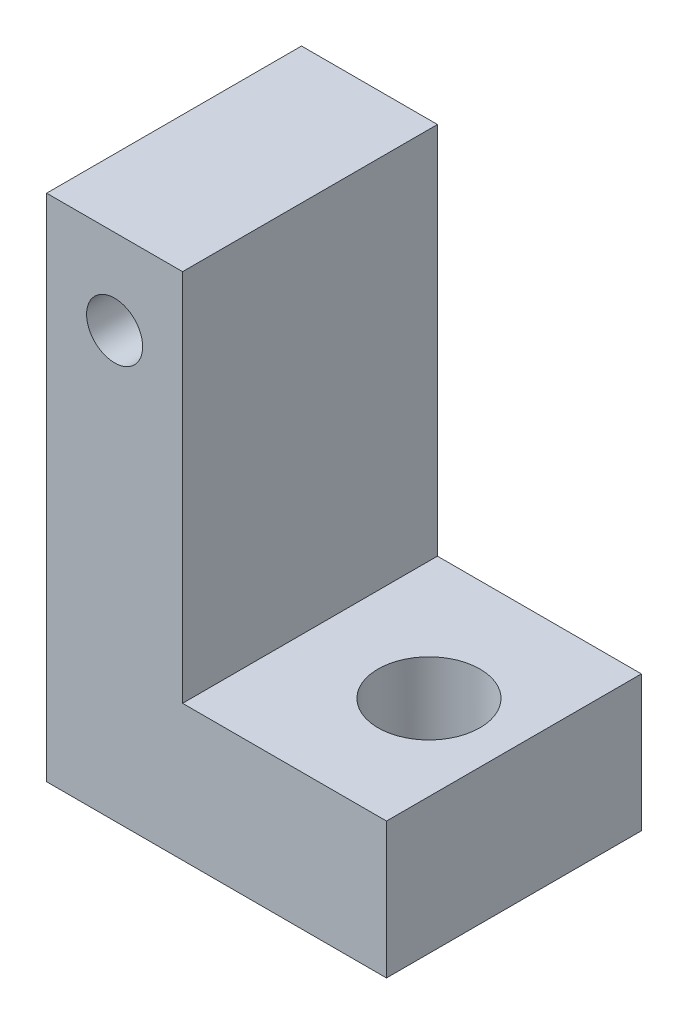
ISO-10303-21;
HEADER;
FILE_DESCRIPTION(('STEP AP214'),'2;1');
FILE_NAME('part.step','',(''),(''),'','','');
FILE_SCHEMA(('AUTOMOTIVE_DESIGN { 1 0 10303 214 1 1 1 1 }'));
ENDSEC;
DATA;
#1=APPLICATION_CONTEXT('core data for automotive mechanical design processes');
#2=APPLICATION_PROTOCOL_DEFINITION('international standard','automotive_design',2000,#1);
#3=PRODUCT_CONTEXT('',#1,'mechanical');
#4=PRODUCT('Part','Part','',(#3));
#5=PRODUCT_RELATED_PRODUCT_CATEGORY('part','',(#4));
#6=PRODUCT_DEFINITION_FORMATION('','',#4);
#7=PRODUCT_DEFINITION_CONTEXT('part definition',#1,'design');
#8=PRODUCT_DEFINITION('design','',#6,#7);
#9=PRODUCT_DEFINITION_SHAPE('','',#8);
#10=(LENGTH_UNIT() NAMED_UNIT(*) SI_UNIT(.MILLI.,.METRE.));
#11=(NAMED_UNIT(*) PLANE_ANGLE_UNIT() SI_UNIT($,.RADIAN.));
#12=(NAMED_UNIT(*) SI_UNIT($,.STERADIAN.) SOLID_ANGLE_UNIT());
#13=UNCERTAINTY_MEASURE_WITH_UNIT(LENGTH_MEASURE(1.E-05),#10,'distance_accuracy_value','');
#14=(GEOMETRIC_REPRESENTATION_CONTEXT(3) GLOBAL_UNCERTAINTY_ASSIGNED_CONTEXT((#13)) GLOBAL_UNIT_ASSIGNED_CONTEXT((#10,
#11,#12)) REPRESENTATION_CONTEXT('',''));
#15=CARTESIAN_POINT('',(0.,0.,0.));
#16=DIRECTION('',(0.,0.,1.));
#17=DIRECTION('',(1.,0.,0.));
#18=AXIS2_PLACEMENT_3D('',#15,#16,#17);
#19=CARTESIAN_POINT('',(0.,8.,15.));
#20=DIRECTION('',(-1.,0.,0.));
#21=DIRECTION('',(0.,-1.,0.));
#22=AXIS2_PLACEMENT_3D('',#19,#20,#21);
#23=PLANE('',#22);
#24=DIRECTION('',(0.,1.,0.));
#25=VECTOR('',#24,1.);
#26=CARTESIAN_POINT('',(0.,8.,0.));
#27=LINE('',#26,#25);
#28=CARTESIAN_POINT('',(0.,0.,0.));
#29=VERTEX_POINT('',#28);
#30=CARTESIAN_POINT('',(0.,8.,0.));
#31=VERTEX_POINT('',#30);
#32=EDGE_CURVE('E119',#29,#31,#27,.T.);
#33=ORIENTED_EDGE('',*,*,#32,.T.);
#34=DIRECTION('',(0.,0.,-1.));
#35=VECTOR('',#34,1.);
#36=CARTESIAN_POINT('',(0.,8.,15.));
#37=LINE('',#36,#35);
#38=CARTESIAN_POINT('',(0.,8.,15.));
#39=VERTEX_POINT('',#38);
#40=EDGE_CURVE('E11',#39,#31,#37,.T.);
#41=ORIENTED_EDGE('',*,*,#40,.F.);
#42=DIRECTION('',(0.,1.,0.));
#43=VECTOR('',#42,1.);
#44=CARTESIAN_POINT('',(0.,8.,15.));
#45=LINE('',#44,#43);
#46=CARTESIAN_POINT('',(0.,0.,15.));
#47=VERTEX_POINT('',#46);
#48=EDGE_CURVE('E130',#47,#39,#45,.T.);
#49=ORIENTED_EDGE('',*,*,#48,.F.);
#50=DIRECTION('',(0.,0.,-1.));
#51=VECTOR('',#50,1.);
#52=CARTESIAN_POINT('',(0.,0.,15.));
#53=LINE('',#52,#51);
#54=EDGE_CURVE('E115',#47,#29,#53,.T.);
#55=ORIENTED_EDGE('',*,*,#54,.T.);
#56=EDGE_LOOP('',(#33,#41,#49,#55));
#57=FACE_BOUND('',#56,.T.);
#58=ADVANCED_FACE('F35',(#57),#23,.F.);
#59=CARTESIAN_POINT('',(-12.,8.,15.));
#60=DIRECTION('',(0.,-1.,0.));
#61=DIRECTION('',(0.,0.,-1.));
#62=AXIS2_PLACEMENT_3D('',#59,#60,#61);
#63=PLANE('',#62);
#64=CARTESIAN_POINT('',(-5.,8.,7.5));
#65=DIRECTION('',(0.,-1.,0.));
#66=DIRECTION('',(0.,0.,-1.));
#67=AXIS2_PLACEMENT_3D('',#64,#65,#66);
#68=CIRCLE('',#67,3.);
#69=CARTESIAN_POINT('',(-5.,8.,4.5));
#70=VERTEX_POINT('',#69);
#71=EDGE_CURVE('E123',#70,#70,#68,.T.);
#72=ORIENTED_EDGE('',*,*,#71,.T.);
#73=EDGE_LOOP('',(#72));
#74=FACE_BOUND('',#73,.T.);
#75=DIRECTION('',(-1.,0.,0.));
#76=VECTOR('',#75,1.);
#77=CARTESIAN_POINT('',(-12.,8.,0.));
#78=LINE('',#77,#76);
#79=CARTESIAN_POINT('',(-12.,8.,0.));
#80=VERTEX_POINT('',#79);
#81=EDGE_CURVE('E122',#31,#80,#78,.T.);
#82=ORIENTED_EDGE('',*,*,#81,.T.);
#83=DIRECTION('',(0.,0.,-1.));
#84=VECTOR('',#83,1.);
#85=CARTESIAN_POINT('',(-12.,8.,15.));
#86=LINE('',#85,#84);
#87=CARTESIAN_POINT('',(-12.,8.,15.));
#88=VERTEX_POINT('',#87);
#89=EDGE_CURVE('E43',#88,#80,#86,.T.);
#90=ORIENTED_EDGE('',*,*,#89,.F.);
#91=DIRECTION('',(-1.,0.,0.));
#92=VECTOR('',#91,1.);
#93=CARTESIAN_POINT('',(-12.,8.,15.));
#94=LINE('',#93,#92);
#95=EDGE_CURVE('E88',#39,#88,#94,.T.);
#96=ORIENTED_EDGE('',*,*,#95,.F.);
#97=ORIENTED_EDGE('',*,*,#40,.T.);
#98=EDGE_LOOP('',(#82,#90,#96,#97));
#99=FACE_BOUND('',#98,.T.);
#100=ADVANCED_FACE('F157',(#74,#99),#63,.F.);
#101=CARTESIAN_POINT('',(-12.,30.,15.));
#102=DIRECTION('',(-1.,0.,0.));
#103=DIRECTION('',(0.,-1.,0.));
#104=AXIS2_PLACEMENT_3D('',#101,#102,#103);
#105=PLANE('',#104);
#106=DIRECTION('',(0.,1.,0.));
#107=VECTOR('',#106,1.);
#108=CARTESIAN_POINT('',(-12.,30.,0.));
#109=LINE('',#108,#107);
#110=CARTESIAN_POINT('',(-12.,30.,0.));
#111=VERTEX_POINT('',#110);
#112=EDGE_CURVE('E125',#80,#111,#109,.T.);
#113=ORIENTED_EDGE('',*,*,#112,.T.);
#114=DIRECTION('',(0.,0.,-1.));
#115=VECTOR('',#114,1.);
#116=CARTESIAN_POINT('',(-12.,30.,15.));
#117=LINE('',#116,#115);
#118=CARTESIAN_POINT('',(-12.,30.,15.));
#119=VERTEX_POINT('',#118);
#120=EDGE_CURVE('E110',#119,#111,#117,.T.);
#121=ORIENTED_EDGE('',*,*,#120,.F.);
#122=DIRECTION('',(0.,1.,0.));
#123=VECTOR('',#122,1.);
#124=CARTESIAN_POINT('',(-12.,30.,15.));
#125=LINE('',#124,#123);
#126=EDGE_CURVE('E101',#88,#119,#125,.T.);
#127=ORIENTED_EDGE('',*,*,#126,.F.);
#128=ORIENTED_EDGE('',*,*,#89,.T.);
#129=EDGE_LOOP('',(#113,#121,#127,#128));
#130=FACE_BOUND('',#129,.T.);
#131=ADVANCED_FACE('F136',(#130),#105,.F.);
#132=CARTESIAN_POINT('',(-20.,30.,15.));
#133=DIRECTION('',(0.,-1.,0.));
#134=DIRECTION('',(0.,0.,-1.));
#135=AXIS2_PLACEMENT_3D('',#132,#133,#134);
#136=PLANE('',#135);
#137=DIRECTION('',(-1.,0.,0.));
#138=VECTOR('',#137,1.);
#139=CARTESIAN_POINT('',(-20.,30.,0.));
#140=LINE('',#139,#138);
#141=CARTESIAN_POINT('',(-20.,30.,0.));
#142=VERTEX_POINT('',#141);
#143=EDGE_CURVE('E109',#111,#142,#140,.T.);
#144=ORIENTED_EDGE('',*,*,#143,.T.);
#145=DIRECTION('',(0.,0.,-1.));
#146=VECTOR('',#145,1.);
#147=CARTESIAN_POINT('',(-20.,30.,15.));
#148=LINE('',#147,#146);
#149=CARTESIAN_POINT('',(-20.,30.,15.));
#150=VERTEX_POINT('',#149);
#151=EDGE_CURVE('E106',#150,#142,#148,.T.);
#152=ORIENTED_EDGE('',*,*,#151,.F.);
#153=DIRECTION('',(-1.,0.,0.));
#154=VECTOR('',#153,1.);
#155=CARTESIAN_POINT('',(-20.,30.,15.));
#156=LINE('',#155,#154);
#157=EDGE_CURVE('E95',#119,#150,#156,.T.);
#158=ORIENTED_EDGE('',*,*,#157,.F.);
#159=ORIENTED_EDGE('',*,*,#120,.T.);
#160=EDGE_LOOP('',(#144,#152,#158,#159));
#161=FACE_BOUND('',#160,.T.);
#162=ADVANCED_FACE('F107',(#161),#136,.F.);
#163=CARTESIAN_POINT('',(-20.,0.,15.));
#164=DIRECTION('',(1.,0.,0.));
#165=DIRECTION('',(0.,0.,-1.));
#166=AXIS2_PLACEMENT_3D('',#163,#164,#165);
#167=PLANE('',#166);
#168=DIRECTION('',(0.,-1.,0.));
#169=VECTOR('',#168,1.);
#170=CARTESIAN_POINT('',(-20.,0.,0.));
#171=LINE('',#170,#169);
#172=CARTESIAN_POINT('',(-20.,0.,0.));
#173=VERTEX_POINT('',#172);
#174=EDGE_CURVE('E74',#142,#173,#171,.T.);
#175=ORIENTED_EDGE('',*,*,#174,.T.);
#176=DIRECTION('',(0.,0.,-1.));
#177=VECTOR('',#176,1.);
#178=CARTESIAN_POINT('',(-20.,0.,15.));
#179=LINE('',#178,#177);
#180=CARTESIAN_POINT('',(-20.,0.,15.));
#181=VERTEX_POINT('',#180);
#182=EDGE_CURVE('E111',#181,#173,#179,.T.);
#183=ORIENTED_EDGE('',*,*,#182,.F.);
#184=DIRECTION('',(0.,-1.,0.));
#185=VECTOR('',#184,1.);
#186=CARTESIAN_POINT('',(-20.,0.,15.));
#187=LINE('',#186,#185);
#188=EDGE_CURVE('E99',#150,#181,#187,.T.);
#189=ORIENTED_EDGE('',*,*,#188,.F.);
#190=ORIENTED_EDGE('',*,*,#151,.T.);
#191=EDGE_LOOP('',(#175,#183,#189,#190));
#192=FACE_BOUND('',#191,.T.);
#193=ADVANCED_FACE('F113',(#192),#167,.F.);
#194=CARTESIAN_POINT('',(0.,0.,15.));
#195=DIRECTION('',(0.,1.,0.));
#196=DIRECTION('',(-1.,0.,0.));
#197=AXIS2_PLACEMENT_3D('',#194,#195,#196);
#198=PLANE('',#197);
#199=CARTESIAN_POINT('',(-5.,0.,7.5));
#200=DIRECTION('',(0.,-1.,0.));
#201=DIRECTION('',(1.,0.,0.));
#202=AXIS2_PLACEMENT_3D('',#199,#200,#201);
#203=CIRCLE('',#202,3.);
#204=CARTESIAN_POINT('',(-2.,0.,7.5));
#205=VERTEX_POINT('',#204);
#206=EDGE_CURVE('E235',#205,#205,#203,.T.);
#207=ORIENTED_EDGE('',*,*,#206,.F.);
#208=EDGE_LOOP('',(#207));
#209=FACE_BOUND('',#208,.T.);
#210=DIRECTION('',(1.,0.,0.));
#211=VECTOR('',#210,1.);
#212=CARTESIAN_POINT('',(0.,0.,0.));
#213=LINE('',#212,#211);
#214=EDGE_CURVE('E80',#173,#29,#213,.T.);
#215=ORIENTED_EDGE('',*,*,#214,.T.);
#216=ORIENTED_EDGE('',*,*,#54,.F.);
#217=DIRECTION('',(1.,0.,0.));
#218=VECTOR('',#217,1.);
#219=CARTESIAN_POINT('',(0.,0.,15.));
#220=LINE('',#219,#218);
#221=EDGE_CURVE('E51',#181,#47,#220,.T.);
#222=ORIENTED_EDGE('',*,*,#221,.F.);
#223=ORIENTED_EDGE('',*,*,#182,.T.);
#224=EDGE_LOOP('',(#215,#216,#222,#223));
#225=FACE_BOUND('',#224,.T.);
#226=ADVANCED_FACE('F143',(#209,#225),#198,.F.);
#227=CARTESIAN_POINT('',(0.,0.,15.));
#228=DIRECTION('',(0.,0.,-1.));
#229=DIRECTION('',(-1.,0.,0.));
#230=AXIS2_PLACEMENT_3D('',#227,#228,#229);
#231=PLANE('',#230);
#232=CARTESIAN_POINT('',(-16.,25.,15.));
#233=DIRECTION('',(0.,0.,1.));
#234=DIRECTION('',(1.,0.,0.));
#235=AXIS2_PLACEMENT_3D('',#232,#233,#234);
#236=CIRCLE('',#235,1.64999999999999);
#237=CARTESIAN_POINT('',(-14.35,25.,15.));
#238=VERTEX_POINT('',#237);
#239=EDGE_CURVE('E233',#238,#238,#236,.T.);
#240=ORIENTED_EDGE('',*,*,#239,.F.);
#241=EDGE_LOOP('',(#240));
#242=FACE_BOUND('',#241,.T.);
#243=ORIENTED_EDGE('',*,*,#48,.T.);
#244=ORIENTED_EDGE('',*,*,#95,.T.);
#245=ORIENTED_EDGE('',*,*,#126,.T.);
#246=ORIENTED_EDGE('',*,*,#157,.T.);
#247=ORIENTED_EDGE('',*,*,#188,.T.);
#248=ORIENTED_EDGE('',*,*,#221,.T.);
#249=EDGE_LOOP('',(#243,#244,#245,#246,#247,#248));
#250=FACE_BOUND('',#249,.T.);
#251=ADVANCED_FACE('F97',(#242,#250),#231,.F.);
#252=CARTESIAN_POINT('',(0.,0.,0.));
#253=DIRECTION('',(0.,0.,-1.));
#254=DIRECTION('',(-1.,0.,0.));
#255=AXIS2_PLACEMENT_3D('',#252,#253,#254);
#256=PLANE('',#255);
#257=CARTESIAN_POINT('',(-16.,25.,0.));
#258=DIRECTION('',(0.,0.,1.));
#259=DIRECTION('',(1.,0.,0.));
#260=AXIS2_PLACEMENT_3D('',#257,#258,#259);
#261=CIRCLE('',#260,1.65);
#262=CARTESIAN_POINT('',(-14.35,25.,0.));
#263=VERTEX_POINT('',#262);
#264=EDGE_CURVE('E230',#263,#263,#261,.T.);
#265=ORIENTED_EDGE('',*,*,#264,.T.);
#266=EDGE_LOOP('',(#265));
#267=FACE_BOUND('',#266,.T.);
#268=ORIENTED_EDGE('',*,*,#32,.F.);
#269=ORIENTED_EDGE('',*,*,#214,.F.);
#270=ORIENTED_EDGE('',*,*,#174,.F.);
#271=ORIENTED_EDGE('',*,*,#143,.F.);
#272=ORIENTED_EDGE('',*,*,#112,.F.);
#273=ORIENTED_EDGE('',*,*,#81,.F.);
#274=EDGE_LOOP('',(#268,#269,#270,#271,#272,#273));
#275=FACE_BOUND('',#274,.T.);
#276=ADVANCED_FACE('F139',(#267,#275),#256,.T.);
#277=CARTESIAN_POINT('',(-5.,15.,7.5));
#278=DIRECTION('',(0.,-1.,0.));
#279=DIRECTION('',(1.,0.,0.));
#280=AXIS2_PLACEMENT_3D('',#277,#278,#279);
#281=CYLINDRICAL_SURFACE('',#280,3.);
#282=ORIENTED_EDGE('',*,*,#206,.T.);
#283=EDGE_LOOP('',(#282));
#284=FACE_BOUND('',#283,.T.);
#285=ORIENTED_EDGE('',*,*,#71,.F.);
#286=EDGE_LOOP('',(#285));
#287=FACE_BOUND('',#286,.T.);
#288=ADVANCED_FACE('F193',(#284,#287),#281,.F.);
#289=CARTESIAN_POINT('',(-16.,25.,15.));
#290=DIRECTION('',(0.,0.,1.));
#291=DIRECTION('',(1.,0.,0.));
#292=AXIS2_PLACEMENT_3D('',#289,#290,#291);
#293=CYLINDRICAL_SURFACE('',#292,1.64999999999999);
#294=ORIENTED_EDGE('',*,*,#264,.F.);
#295=EDGE_LOOP('',(#294));
#296=FACE_BOUND('',#295,.T.);
#297=ORIENTED_EDGE('',*,*,#239,.T.);
#298=EDGE_LOOP('',(#297));
#299=FACE_BOUND('',#298,.T.);
#300=ADVANCED_FACE('F198',(#296,#299),#293,.F.);
#301=CLOSED_SHELL('',(#58,#100,#131,#162,#193,#226,#251,#276,#288,#300));
#302=MANIFOLD_SOLID_BREP('B2',#301);
#303=ADVANCED_BREP_SHAPE_REPRESENTATION('',(#18,#302),#14);
#304=SHAPE_DEFINITION_REPRESENTATION(#9,#303);
ENDSEC;
END-ISO-10303-21;
